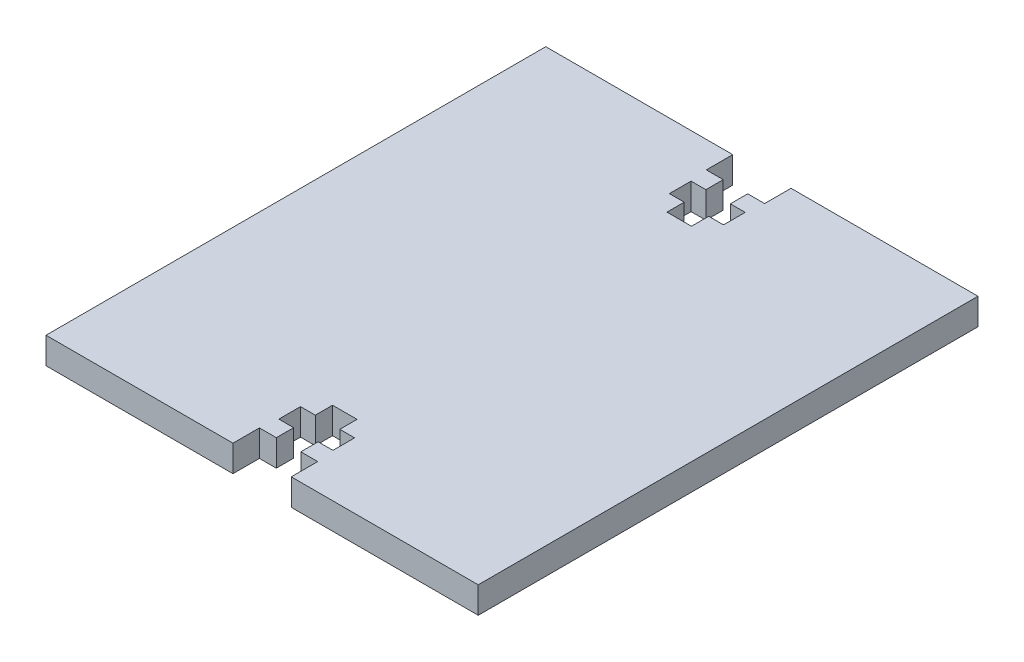
ISO-10303-21;
HEADER;
FILE_DESCRIPTION(('STEP AP214'),'2;1');
FILE_NAME('part.step','',(''),(''),'','','');
FILE_SCHEMA(('AUTOMOTIVE_DESIGN { 1 0 10303 214 1 1 1 1 }'));
ENDSEC;
DATA;
#1=APPLICATION_CONTEXT('core data for automotive mechanical design processes');
#2=APPLICATION_PROTOCOL_DEFINITION('international standard','automotive_design',2000,#1);
#3=PRODUCT_CONTEXT('',#1,'mechanical');
#4=PRODUCT('Part','Part','',(#3));
#5=PRODUCT_RELATED_PRODUCT_CATEGORY('part','',(#4));
#6=PRODUCT_DEFINITION_FORMATION('','',#4);
#7=PRODUCT_DEFINITION_CONTEXT('part definition',#1,'design');
#8=PRODUCT_DEFINITION('design','',#6,#7);
#9=PRODUCT_DEFINITION_SHAPE('','',#8);
#10=(LENGTH_UNIT() NAMED_UNIT(*) SI_UNIT(.MILLI.,.METRE.));
#11=(NAMED_UNIT(*) PLANE_ANGLE_UNIT() SI_UNIT($,.RADIAN.));
#12=(NAMED_UNIT(*) SI_UNIT($,.STERADIAN.) SOLID_ANGLE_UNIT());
#13=UNCERTAINTY_MEASURE_WITH_UNIT(LENGTH_MEASURE(1.E-05),#10,'distance_accuracy_value','');
#14=(GEOMETRIC_REPRESENTATION_CONTEXT(3) GLOBAL_UNCERTAINTY_ASSIGNED_CONTEXT((#13)) GLOBAL_UNIT_ASSIGNED_CONTEXT((#10,
#11,#12)) REPRESENTATION_CONTEXT('',''));
#15=CARTESIAN_POINT('',(0.,0.,0.));
#16=DIRECTION('',(0.,0.,1.));
#17=DIRECTION('',(1.,0.,0.));
#18=AXIS2_PLACEMENT_3D('',#15,#16,#17);
#19=CARTESIAN_POINT('',(-25.945,3.175,-30.));
#20=DIRECTION('',(0.,0.,1.));
#21=DIRECTION('',(1.,0.,0.));
#22=AXIS2_PLACEMENT_3D('',#19,#20,#21);
#23=PLANE('',#22);
#24=DIRECTION('',(-1.,0.,0.));
#25=VECTOR('',#24,1.);
#26=CARTESIAN_POINT('',(-25.945,3.175,-30.));
#27=LINE('',#26,#25);
#28=CARTESIAN_POINT('',(-3.5,3.175,-30.));
#29=VERTEX_POINT('',#28);
#30=CARTESIAN_POINT('',(-25.945,3.175,-30.));
#31=VERTEX_POINT('',#30);
#32=EDGE_CURVE('E435',#29,#31,#27,.T.);
#33=ORIENTED_EDGE('',*,*,#32,.F.);
#34=DIRECTION('',(0.,1.,0.));
#35=VECTOR('',#34,1.);
#36=CARTESIAN_POINT('',(-3.5,-6.825,-30.));
#37=LINE('',#36,#35);
#38=CARTESIAN_POINT('',(-3.5,0.,-30.));
#39=VERTEX_POINT('',#38);
#40=EDGE_CURVE('E282',#39,#29,#37,.T.);
#41=ORIENTED_EDGE('',*,*,#40,.F.);
#42=DIRECTION('',(-1.,0.,0.));
#43=VECTOR('',#42,1.);
#44=CARTESIAN_POINT('',(-25.945,0.,-30.));
#45=LINE('',#44,#43);
#46=CARTESIAN_POINT('',(-25.945,0.,-30.));
#47=VERTEX_POINT('',#46);
#48=EDGE_CURVE('E449',#39,#47,#45,.T.);
#49=ORIENTED_EDGE('',*,*,#48,.T.);
#50=DIRECTION('',(0.,-1.,0.));
#51=VECTOR('',#50,1.);
#52=CARTESIAN_POINT('',(-25.945,3.175,-30.));
#53=LINE('',#52,#51);
#54=EDGE_CURVE('E463',#31,#47,#53,.T.);
#55=ORIENTED_EDGE('',*,*,#54,.F.);
#56=EDGE_LOOP('',(#33,#41,#49,#55));
#57=FACE_BOUND('',#56,.T.);
#58=ADVANCED_FACE('F36',(#57),#23,.F.);
#59=CARTESIAN_POINT('',(-25.945,3.175,30.));
#60=DIRECTION('',(0.,0.,-1.));
#61=DIRECTION('',(-1.,0.,0.));
#62=AXIS2_PLACEMENT_3D('',#59,#60,#61);
#63=PLANE('',#62);
#64=DIRECTION('',(1.,0.,0.));
#65=VECTOR('',#64,1.);
#66=CARTESIAN_POINT('',(-25.945,3.175,30.));
#67=LINE('',#66,#65);
#68=CARTESIAN_POINT('',(3.5,3.175,30.));
#69=VERTEX_POINT('',#68);
#70=CARTESIAN_POINT('',(25.945,3.175,30.));
#71=VERTEX_POINT('',#70);
#72=EDGE_CURVE('E442',#69,#71,#67,.T.);
#73=ORIENTED_EDGE('',*,*,#72,.F.);
#74=DIRECTION('',(0.,1.,0.));
#75=VECTOR('',#74,1.);
#76=CARTESIAN_POINT('',(3.5,-6.825,30.));
#77=LINE('',#76,#75);
#78=CARTESIAN_POINT('',(3.5,0.,30.));
#79=VERTEX_POINT('',#78);
#80=EDGE_CURVE('E403',#79,#69,#77,.T.);
#81=ORIENTED_EDGE('',*,*,#80,.F.);
#82=DIRECTION('',(1.,0.,0.));
#83=VECTOR('',#82,1.);
#84=CARTESIAN_POINT('',(-25.945,0.,30.));
#85=LINE('',#84,#83);
#86=CARTESIAN_POINT('',(25.945,0.,30.));
#87=VERTEX_POINT('',#86);
#88=EDGE_CURVE('E455',#79,#87,#85,.T.);
#89=ORIENTED_EDGE('',*,*,#88,.T.);
#90=DIRECTION('',(0.,-1.,0.));
#91=VECTOR('',#90,1.);
#92=CARTESIAN_POINT('',(25.945,3.175,30.));
#93=LINE('',#92,#91);
#94=EDGE_CURVE('E446',#71,#87,#93,.T.);
#95=ORIENTED_EDGE('',*,*,#94,.F.);
#96=EDGE_LOOP('',(#73,#81,#89,#95));
#97=FACE_BOUND('',#96,.T.);
#98=ADVANCED_FACE('F567',(#97),#63,.F.);
#99=CARTESIAN_POINT('',(25.945,3.175,-30.));
#100=DIRECTION('',(-1.,0.,0.));
#101=DIRECTION('',(0.,0.,1.));
#102=AXIS2_PLACEMENT_3D('',#99,#100,#101);
#103=PLANE('',#102);
#104=DIRECTION('',(0.,0.,-1.));
#105=VECTOR('',#104,1.);
#106=CARTESIAN_POINT('',(25.945,0.,-30.));
#107=LINE('',#106,#105);
#108=CARTESIAN_POINT('',(25.945,0.,-30.));
#109=VERTEX_POINT('',#108);
#110=EDGE_CURVE('E329',#87,#109,#107,.T.);
#111=ORIENTED_EDGE('',*,*,#110,.T.);
#112=DIRECTION('',(0.,-1.,0.));
#113=VECTOR('',#112,1.);
#114=CARTESIAN_POINT('',(25.945,3.175,-30.));
#115=LINE('',#114,#113);
#116=CARTESIAN_POINT('',(25.945,3.175,-30.));
#117=VERTEX_POINT('',#116);
#118=EDGE_CURVE('E466',#117,#109,#115,.T.);
#119=ORIENTED_EDGE('',*,*,#118,.F.);
#120=DIRECTION('',(0.,0.,-1.));
#121=VECTOR('',#120,1.);
#122=CARTESIAN_POINT('',(25.945,3.175,-30.));
#123=LINE('',#122,#121);
#124=EDGE_CURVE('E432',#71,#117,#123,.T.);
#125=ORIENTED_EDGE('',*,*,#124,.F.);
#126=ORIENTED_EDGE('',*,*,#94,.T.);
#127=EDGE_LOOP('',(#111,#119,#125,#126));
#128=FACE_BOUND('',#127,.T.);
#129=ADVANCED_FACE('F38',(#128),#103,.F.);
#130=CARTESIAN_POINT('',(3.5,0.,-30.));
#131=VERTEX_POINT('',#130);
#132=EDGE_CURVE('E450',#109,#131,#45,.T.);
#133=ORIENTED_EDGE('',*,*,#132,.T.);
#134=DIRECTION('',(0.,1.,0.));
#135=VECTOR('',#134,1.);
#136=CARTESIAN_POINT('',(3.5,-6.825,-30.));
#137=LINE('',#136,#135);
#138=CARTESIAN_POINT('',(3.5,3.175,-30.));
#139=VERTEX_POINT('',#138);
#140=EDGE_CURVE('E330',#131,#139,#137,.T.);
#141=ORIENTED_EDGE('',*,*,#140,.T.);
#142=EDGE_CURVE('E437',#117,#139,#27,.T.);
#143=ORIENTED_EDGE('',*,*,#142,.F.);
#144=ORIENTED_EDGE('',*,*,#118,.T.);
#145=EDGE_LOOP('',(#133,#141,#143,#144));
#146=FACE_BOUND('',#145,.T.);
#147=ADVANCED_FACE('F558',(#146),#23,.F.);
#148=CARTESIAN_POINT('',(-25.945,3.175,-30.));
#149=DIRECTION('',(1.,0.,0.));
#150=DIRECTION('',(0.,0.,-1.));
#151=AXIS2_PLACEMENT_3D('',#148,#149,#150);
#152=PLANE('',#151);
#153=DIRECTION('',(0.,0.,1.));
#154=VECTOR('',#153,1.);
#155=CARTESIAN_POINT('',(-25.945,0.,-30.));
#156=LINE('',#155,#154);
#157=CARTESIAN_POINT('',(-25.945,0.,30.));
#158=VERTEX_POINT('',#157);
#159=EDGE_CURVE('E453',#47,#158,#156,.T.);
#160=ORIENTED_EDGE('',*,*,#159,.T.);
#161=DIRECTION('',(0.,-1.,0.));
#162=VECTOR('',#161,1.);
#163=CARTESIAN_POINT('',(-25.945,3.175,30.));
#164=LINE('',#163,#162);
#165=CARTESIAN_POINT('',(-25.945,3.175,30.));
#166=VERTEX_POINT('',#165);
#167=EDGE_CURVE('E460',#166,#158,#164,.T.);
#168=ORIENTED_EDGE('',*,*,#167,.F.);
#169=DIRECTION('',(0.,0.,1.));
#170=VECTOR('',#169,1.);
#171=CARTESIAN_POINT('',(-25.945,3.175,-30.));
#172=LINE('',#171,#170);
#173=EDGE_CURVE('E440',#31,#166,#172,.T.);
#174=ORIENTED_EDGE('',*,*,#173,.F.);
#175=ORIENTED_EDGE('',*,*,#54,.T.);
#176=EDGE_LOOP('',(#160,#168,#174,#175));
#177=FACE_BOUND('',#176,.T.);
#178=ADVANCED_FACE('F632',(#177),#152,.F.);
#179=CARTESIAN_POINT('',(-3.5,0.,30.));
#180=VERTEX_POINT('',#179);
#181=EDGE_CURVE('E436',#158,#180,#85,.T.);
#182=ORIENTED_EDGE('',*,*,#181,.T.);
#183=DIRECTION('',(0.,1.,0.));
#184=VECTOR('',#183,1.);
#185=CARTESIAN_POINT('',(-3.5,-6.825,30.));
#186=LINE('',#185,#184);
#187=CARTESIAN_POINT('',(-3.5,3.175,30.));
#188=VERTEX_POINT('',#187);
#189=EDGE_CURVE('E405',#180,#188,#186,.T.);
#190=ORIENTED_EDGE('',*,*,#189,.T.);
#191=EDGE_CURVE('E443',#166,#188,#67,.T.);
#192=ORIENTED_EDGE('',*,*,#191,.F.);
#193=ORIENTED_EDGE('',*,*,#167,.T.);
#194=EDGE_LOOP('',(#182,#190,#192,#193));
#195=FACE_BOUND('',#194,.T.);
#196=ADVANCED_FACE('F627',(#195),#63,.F.);
#197=CARTESIAN_POINT('',(0.,3.175,0.));
#198=DIRECTION('',(0.,1.,0.));
#199=DIRECTION('',(0.,0.,1.));
#200=AXIS2_PLACEMENT_3D('',#197,#198,#199);
#201=PLANE('',#200);
#202=DIRECTION('',(0.,0.,1.));
#203=VECTOR('',#202,1.);
#204=CARTESIAN_POINT('',(-3.5,3.175,-30.));
#205=LINE('',#204,#203);
#206=CARTESIAN_POINT('',(-3.5,3.175,-26.825));
#207=VERTEX_POINT('',#206);
#208=EDGE_CURVE('E279',#29,#207,#205,.T.);
#209=ORIENTED_EDGE('',*,*,#208,.F.);
#210=ORIENTED_EDGE('',*,*,#32,.T.);
#211=ORIENTED_EDGE('',*,*,#173,.T.);
#212=ORIENTED_EDGE('',*,*,#191,.T.);
#213=DIRECTION('',(0.,0.,1.));
#214=VECTOR('',#213,1.);
#215=CARTESIAN_POINT('',(-3.5,3.175,30.));
#216=LINE('',#215,#214);
#217=CARTESIAN_POINT('',(-3.5,3.175,26.825));
#218=VERTEX_POINT('',#217);
#219=EDGE_CURVE('E396',#218,#188,#216,.T.);
#220=ORIENTED_EDGE('',*,*,#219,.F.);
#221=DIRECTION('',(-1.,0.,0.));
#222=VECTOR('',#221,1.);
#223=CARTESIAN_POINT('',(-3.5,3.175,26.825));
#224=LINE('',#223,#222);
#225=CARTESIAN_POINT('',(-1.47,3.175,26.825));
#226=VERTEX_POINT('',#225);
#227=EDGE_CURVE('E393',#226,#218,#224,.T.);
#228=ORIENTED_EDGE('',*,*,#227,.F.);
#229=DIRECTION('',(0.,0.,1.));
#230=VECTOR('',#229,1.);
#231=CARTESIAN_POINT('',(-1.47,3.175,26.825));
#232=LINE('',#231,#230);
#233=CARTESIAN_POINT('',(-1.47,3.175,24.745));
#234=VERTEX_POINT('',#233);
#235=EDGE_CURVE('E390',#234,#226,#232,.T.);
#236=ORIENTED_EDGE('',*,*,#235,.F.);
#237=DIRECTION('',(1.,0.,0.));
#238=VECTOR('',#237,1.);
#239=CARTESIAN_POINT('',(-3.25,3.175,24.745));
#240=LINE('',#239,#238);
#241=CARTESIAN_POINT('',(-3.25,3.175,24.745));
#242=VERTEX_POINT('',#241);
#243=EDGE_CURVE('E387',#242,#234,#240,.T.);
#244=ORIENTED_EDGE('',*,*,#243,.F.);
#245=DIRECTION('',(0.,0.,1.));
#246=VECTOR('',#245,1.);
#247=CARTESIAN_POINT('',(-3.25,3.175,24.745));
#248=LINE('',#247,#246);
#249=CARTESIAN_POINT('',(-3.25,3.175,22.145));
#250=VERTEX_POINT('',#249);
#251=EDGE_CURVE('E384',#250,#242,#248,.T.);
#252=ORIENTED_EDGE('',*,*,#251,.F.);
#253=DIRECTION('',(-1.,0.,0.));
#254=VECTOR('',#253,1.);
#255=CARTESIAN_POINT('',(-3.25,3.175,22.145));
#256=LINE('',#255,#254);
#257=CARTESIAN_POINT('',(-1.47,3.175,22.145));
#258=VERTEX_POINT('',#257);
#259=EDGE_CURVE('E381',#258,#250,#256,.T.);
#260=ORIENTED_EDGE('',*,*,#259,.F.);
#261=DIRECTION('',(0.,0.,1.));
#262=VECTOR('',#261,1.);
#263=CARTESIAN_POINT('',(-1.47,3.175,22.145));
#264=LINE('',#263,#262);
#265=CARTESIAN_POINT('',(-1.47,3.175,20.075));
#266=VERTEX_POINT('',#265);
#267=EDGE_CURVE('E378',#266,#258,#264,.T.);
#268=ORIENTED_EDGE('',*,*,#267,.F.);
#269=DIRECTION('',(-1.,0.,0.));
#270=VECTOR('',#269,1.);
#271=CARTESIAN_POINT('',(-1.47,3.175,20.075));
#272=LINE('',#271,#270);
#273=CARTESIAN_POINT('',(1.47,3.175,20.075));
#274=VERTEX_POINT('',#273);
#275=EDGE_CURVE('E375',#274,#266,#272,.T.);
#276=ORIENTED_EDGE('',*,*,#275,.F.);
#277=DIRECTION('',(0.,0.,-1.));
#278=VECTOR('',#277,1.);
#279=CARTESIAN_POINT('',(1.47,3.175,22.145));
#280=LINE('',#279,#278);
#281=CARTESIAN_POINT('',(1.47,3.175,22.145));
#282=VERTEX_POINT('',#281);
#283=EDGE_CURVE('E372',#282,#274,#280,.T.);
#284=ORIENTED_EDGE('',*,*,#283,.F.);
#285=DIRECTION('',(-1.,0.,0.));
#286=VECTOR('',#285,1.);
#287=CARTESIAN_POINT('',(1.47,3.175,22.145));
#288=LINE('',#287,#286);
#289=CARTESIAN_POINT('',(3.25,3.175,22.145));
#290=VERTEX_POINT('',#289);
#291=EDGE_CURVE('E369',#290,#282,#288,.T.);
#292=ORIENTED_EDGE('',*,*,#291,.F.);
#293=DIRECTION('',(0.,0.,-1.));
#294=VECTOR('',#293,1.);
#295=CARTESIAN_POINT('',(3.25,3.175,24.745));
#296=LINE('',#295,#294);
#297=CARTESIAN_POINT('',(3.25,3.175,24.745));
#298=VERTEX_POINT('',#297);
#299=EDGE_CURVE('E366',#298,#290,#296,.T.);
#300=ORIENTED_EDGE('',*,*,#299,.F.);
#301=DIRECTION('',(1.,0.,0.));
#302=VECTOR('',#301,1.);
#303=CARTESIAN_POINT('',(1.47,3.175,24.745));
#304=LINE('',#303,#302);
#305=CARTESIAN_POINT('',(1.47,3.175,24.745));
#306=VERTEX_POINT('',#305);
#307=EDGE_CURVE('E363',#306,#298,#304,.T.);
#308=ORIENTED_EDGE('',*,*,#307,.F.);
#309=DIRECTION('',(0.,0.,-1.));
#310=VECTOR('',#309,1.);
#311=CARTESIAN_POINT('',(1.47,3.175,26.825));
#312=LINE('',#311,#310);
#313=CARTESIAN_POINT('',(1.47,3.175,26.825));
#314=VERTEX_POINT('',#313);
#315=EDGE_CURVE('E361',#314,#306,#312,.T.);
#316=ORIENTED_EDGE('',*,*,#315,.F.);
#317=DIRECTION('',(-1.,0.,0.));
#318=VECTOR('',#317,1.);
#319=CARTESIAN_POINT('',(1.47,3.175,26.825));
#320=LINE('',#319,#318);
#321=CARTESIAN_POINT('',(3.5,3.175,26.825));
#322=VERTEX_POINT('',#321);
#323=EDGE_CURVE('E358',#322,#314,#320,.T.);
#324=ORIENTED_EDGE('',*,*,#323,.F.);
#325=DIRECTION('',(0.,0.,-1.));
#326=VECTOR('',#325,1.);
#327=CARTESIAN_POINT('',(3.5,3.175,30.));
#328=LINE('',#327,#326);
#329=EDGE_CURVE('E398',#69,#322,#328,.T.);
#330=ORIENTED_EDGE('',*,*,#329,.F.);
#331=ORIENTED_EDGE('',*,*,#72,.T.);
#332=ORIENTED_EDGE('',*,*,#124,.T.);
#333=ORIENTED_EDGE('',*,*,#142,.T.);
#334=DIRECTION('',(0.,0.,-1.));
#335=VECTOR('',#334,1.);
#336=CARTESIAN_POINT('',(3.5,3.175,-30.));
#337=LINE('',#336,#335);
#338=CARTESIAN_POINT('',(3.5,3.175,-26.825));
#339=VERTEX_POINT('',#338);
#340=EDGE_CURVE('E276',#339,#139,#337,.T.);
#341=ORIENTED_EDGE('',*,*,#340,.F.);
#342=DIRECTION('',(1.,0.,0.));
#343=VECTOR('',#342,1.);
#344=CARTESIAN_POINT('',(1.47,3.175,-26.825));
#345=LINE('',#344,#343);
#346=CARTESIAN_POINT('',(1.47,3.175,-26.825));
#347=VERTEX_POINT('',#346);
#348=EDGE_CURVE('E324',#347,#339,#345,.T.);
#349=ORIENTED_EDGE('',*,*,#348,.F.);
#350=DIRECTION('',(0.,0.,-1.));
#351=VECTOR('',#350,1.);
#352=CARTESIAN_POINT('',(1.47,3.175,-26.825));
#353=LINE('',#352,#351);
#354=CARTESIAN_POINT('',(1.47,3.175,-24.745));
#355=VERTEX_POINT('',#354);
#356=EDGE_CURVE('E321',#355,#347,#353,.T.);
#357=ORIENTED_EDGE('',*,*,#356,.F.);
#358=DIRECTION('',(-1.,0.,0.));
#359=VECTOR('',#358,1.);
#360=CARTESIAN_POINT('',(1.47,3.175,-24.745));
#361=LINE('',#360,#359);
#362=CARTESIAN_POINT('',(3.25,3.175,-24.745));
#363=VERTEX_POINT('',#362);
#364=EDGE_CURVE('E318',#363,#355,#361,.T.);
#365=ORIENTED_EDGE('',*,*,#364,.F.);
#366=DIRECTION('',(0.,0.,-1.));
#367=VECTOR('',#366,1.);
#368=CARTESIAN_POINT('',(3.25,3.175,-24.745));
#369=LINE('',#368,#367);
#370=CARTESIAN_POINT('',(3.25,3.175,-22.145));
#371=VERTEX_POINT('',#370);
#372=EDGE_CURVE('E315',#371,#363,#369,.T.);
#373=ORIENTED_EDGE('',*,*,#372,.F.);
#374=DIRECTION('',(1.,0.,0.));
#375=VECTOR('',#374,1.);
#376=CARTESIAN_POINT('',(1.47,3.175,-22.145));
#377=LINE('',#376,#375);
#378=CARTESIAN_POINT('',(1.47,3.175,-22.145));
#379=VERTEX_POINT('',#378);
#380=EDGE_CURVE('E312',#379,#371,#377,.T.);
#381=ORIENTED_EDGE('',*,*,#380,.F.);
#382=DIRECTION('',(0.,0.,-1.));
#383=VECTOR('',#382,1.);
#384=CARTESIAN_POINT('',(1.47,3.175,-22.145));
#385=LINE('',#384,#383);
#386=CARTESIAN_POINT('',(1.47,3.175,-20.075));
#387=VERTEX_POINT('',#386);
#388=EDGE_CURVE('E309',#387,#379,#385,.T.);
#389=ORIENTED_EDGE('',*,*,#388,.F.);
#390=DIRECTION('',(1.,0.,0.));
#391=VECTOR('',#390,1.);
#392=CARTESIAN_POINT('',(-1.47,3.175,-20.075));
#393=LINE('',#392,#391);
#394=CARTESIAN_POINT('',(-1.47,3.175,-20.075));
#395=VERTEX_POINT('',#394);
#396=EDGE_CURVE('E306',#395,#387,#393,.T.);
#397=ORIENTED_EDGE('',*,*,#396,.F.);
#398=DIRECTION('',(0.,0.,1.));
#399=VECTOR('',#398,1.);
#400=CARTESIAN_POINT('',(-1.47,3.175,-22.145));
#401=LINE('',#400,#399);
#402=CARTESIAN_POINT('',(-1.47,3.175,-22.145));
#403=VERTEX_POINT('',#402);
#404=EDGE_CURVE('E303',#403,#395,#401,.T.);
#405=ORIENTED_EDGE('',*,*,#404,.F.);
#406=DIRECTION('',(1.,0.,0.));
#407=VECTOR('',#406,1.);
#408=CARTESIAN_POINT('',(-3.25,3.175,-22.145));
#409=LINE('',#408,#407);
#410=CARTESIAN_POINT('',(-3.25,3.175,-22.145));
#411=VERTEX_POINT('',#410);
#412=EDGE_CURVE('E300',#411,#403,#409,.T.);
#413=ORIENTED_EDGE('',*,*,#412,.F.);
#414=DIRECTION('',(0.,0.,1.));
#415=VECTOR('',#414,1.);
#416=CARTESIAN_POINT('',(-3.25,3.175,-24.745));
#417=LINE('',#416,#415);
#418=CARTESIAN_POINT('',(-3.25,3.175,-24.745));
#419=VERTEX_POINT('',#418);
#420=EDGE_CURVE('E297',#419,#411,#417,.T.);
#421=ORIENTED_EDGE('',*,*,#420,.F.);
#422=DIRECTION('',(-1.,0.,0.));
#423=VECTOR('',#422,1.);
#424=CARTESIAN_POINT('',(-3.25,3.175,-24.745));
#425=LINE('',#424,#423);
#426=CARTESIAN_POINT('',(-1.47,3.175,-24.745));
#427=VERTEX_POINT('',#426);
#428=EDGE_CURVE('E292',#427,#419,#425,.T.);
#429=ORIENTED_EDGE('',*,*,#428,.F.);
#430=DIRECTION('',(0.,0.,1.));
#431=VECTOR('',#430,1.);
#432=CARTESIAN_POINT('',(-1.47,3.175,-26.825));
#433=LINE('',#432,#431);
#434=CARTESIAN_POINT('',(-1.47,3.175,-26.825));
#435=VERTEX_POINT('',#434);
#436=EDGE_CURVE('E290',#435,#427,#433,.T.);
#437=ORIENTED_EDGE('',*,*,#436,.F.);
#438=DIRECTION('',(1.,0.,0.));
#439=VECTOR('',#438,1.);
#440=CARTESIAN_POINT('',(-3.5,3.175,-26.825));
#441=LINE('',#440,#439);
#442=EDGE_CURVE('E271',#207,#435,#441,.T.);
#443=ORIENTED_EDGE('',*,*,#442,.F.);
#444=EDGE_LOOP('',(#209,#210,#211,#212,#220,#228,#236,#244,#252,#260,#268,#276,#284,#292,#300,
#308,#316,#324,#330,#331,#332,#333,#341,#349,#357,#365,#373,#381,#389,#397,#405,#413,#421,#429,
#437,#443));
#445=FACE_BOUND('',#444,.T.);
#446=ADVANCED_FACE('F287',(#445),#201,.T.);
#447=CARTESIAN_POINT('',(0.,0.,0.));
#448=DIRECTION('',(0.,1.,0.));
#449=DIRECTION('',(0.,0.,1.));
#450=AXIS2_PLACEMENT_3D('',#447,#448,#449);
#451=PLANE('',#450);
#452=ORIENTED_EDGE('',*,*,#48,.F.);
#453=DIRECTION('',(0.,0.,1.));
#454=VECTOR('',#453,1.);
#455=CARTESIAN_POINT('',(-3.5,0.,0.));
#456=LINE('',#455,#454);
#457=CARTESIAN_POINT('',(-3.5,0.,-26.825));
#458=VERTEX_POINT('',#457);
#459=EDGE_CURVE('E11',#39,#458,#456,.T.);
#460=ORIENTED_EDGE('',*,*,#459,.T.);
#461=DIRECTION('',(1.,0.,0.));
#462=VECTOR('',#461,1.);
#463=CARTESIAN_POINT('',(0.,0.,-26.825));
#464=LINE('',#463,#462);
#465=CARTESIAN_POINT('',(-1.47,0.,-26.825));
#466=VERTEX_POINT('',#465);
#467=EDGE_CURVE('E274',#458,#466,#464,.T.);
#468=ORIENTED_EDGE('',*,*,#467,.T.);
#469=DIRECTION('',(0.,0.,1.));
#470=VECTOR('',#469,1.);
#471=CARTESIAN_POINT('',(-1.47,0.,0.));
#472=LINE('',#471,#470);
#473=CARTESIAN_POINT('',(-1.47,0.,-24.745));
#474=VERTEX_POINT('',#473);
#475=EDGE_CURVE('E515',#466,#474,#472,.T.);
#476=ORIENTED_EDGE('',*,*,#475,.T.);
#477=DIRECTION('',(-1.,0.,0.));
#478=VECTOR('',#477,1.);
#479=CARTESIAN_POINT('',(0.,0.,-24.745));
#480=LINE('',#479,#478);
#481=CARTESIAN_POINT('',(-3.25,0.,-24.745));
#482=VERTEX_POINT('',#481);
#483=EDGE_CURVE('E518',#474,#482,#480,.T.);
#484=ORIENTED_EDGE('',*,*,#483,.T.);
#485=DIRECTION('',(0.,0.,1.));
#486=VECTOR('',#485,1.);
#487=CARTESIAN_POINT('',(-3.25,0.,0.));
#488=LINE('',#487,#486);
#489=CARTESIAN_POINT('',(-3.25,0.,-22.145));
#490=VERTEX_POINT('',#489);
#491=EDGE_CURVE('E521',#482,#490,#488,.T.);
#492=ORIENTED_EDGE('',*,*,#491,.T.);
#493=DIRECTION('',(1.,0.,0.));
#494=VECTOR('',#493,1.);
#495=CARTESIAN_POINT('',(0.,0.,-22.145));
#496=LINE('',#495,#494);
#497=CARTESIAN_POINT('',(-1.47,0.,-22.145));
#498=VERTEX_POINT('',#497);
#499=EDGE_CURVE('E524',#490,#498,#496,.T.);
#500=ORIENTED_EDGE('',*,*,#499,.T.);
#501=DIRECTION('',(0.,0.,1.));
#502=VECTOR('',#501,1.);
#503=CARTESIAN_POINT('',(-1.47,0.,0.));
#504=LINE('',#503,#502);
#505=CARTESIAN_POINT('',(-1.47,0.,-20.075));
#506=VERTEX_POINT('',#505);
#507=EDGE_CURVE('E527',#498,#506,#504,.T.);
#508=ORIENTED_EDGE('',*,*,#507,.T.);
#509=DIRECTION('',(1.,0.,0.));
#510=VECTOR('',#509,1.);
#511=CARTESIAN_POINT('',(0.,0.,-20.075));
#512=LINE('',#511,#510);
#513=CARTESIAN_POINT('',(1.47,0.,-20.075));
#514=VERTEX_POINT('',#513);
#515=EDGE_CURVE('E530',#506,#514,#512,.T.);
#516=ORIENTED_EDGE('',*,*,#515,.T.);
#517=DIRECTION('',(0.,0.,-1.));
#518=VECTOR('',#517,1.);
#519=CARTESIAN_POINT('',(1.47,0.,0.));
#520=LINE('',#519,#518);
#521=CARTESIAN_POINT('',(1.47,0.,-22.145));
#522=VERTEX_POINT('',#521);
#523=EDGE_CURVE('E533',#514,#522,#520,.T.);
#524=ORIENTED_EDGE('',*,*,#523,.T.);
#525=DIRECTION('',(1.,0.,0.));
#526=VECTOR('',#525,1.);
#527=CARTESIAN_POINT('',(0.,0.,-22.145));
#528=LINE('',#527,#526);
#529=CARTESIAN_POINT('',(3.25,0.,-22.145));
#530=VERTEX_POINT('',#529);
#531=EDGE_CURVE('E536',#522,#530,#528,.T.);
#532=ORIENTED_EDGE('',*,*,#531,.T.);
#533=DIRECTION('',(0.,0.,-1.));
#534=VECTOR('',#533,1.);
#535=CARTESIAN_POINT('',(3.24999999999999,0.,0.));
#536=LINE('',#535,#534);
#537=CARTESIAN_POINT('',(3.25,0.,-24.745));
#538=VERTEX_POINT('',#537);
#539=EDGE_CURVE('E539',#530,#538,#536,.T.);
#540=ORIENTED_EDGE('',*,*,#539,.T.);
#541=DIRECTION('',(-1.,0.,0.));
#542=VECTOR('',#541,1.);
#543=CARTESIAN_POINT('',(0.,0.,-24.745));
#544=LINE('',#543,#542);
#545=CARTESIAN_POINT('',(1.47,0.,-24.745));
#546=VERTEX_POINT('',#545);
#547=EDGE_CURVE('E542',#538,#546,#544,.T.);
#548=ORIENTED_EDGE('',*,*,#547,.T.);
#549=DIRECTION('',(0.,0.,-1.));
#550=VECTOR('',#549,1.);
#551=CARTESIAN_POINT('',(1.47,0.,0.));
#552=LINE('',#551,#550);
#553=CARTESIAN_POINT('',(1.47,0.,-26.825));
#554=VERTEX_POINT('',#553);
#555=EDGE_CURVE('E545',#546,#554,#552,.T.);
#556=ORIENTED_EDGE('',*,*,#555,.T.);
#557=DIRECTION('',(1.,0.,0.));
#558=VECTOR('',#557,1.);
#559=CARTESIAN_POINT('',(0.,0.,-26.825));
#560=LINE('',#559,#558);
#561=CARTESIAN_POINT('',(3.5,0.,-26.825));
#562=VERTEX_POINT('',#561);
#563=EDGE_CURVE('E548',#554,#562,#560,.T.);
#564=ORIENTED_EDGE('',*,*,#563,.T.);
#565=DIRECTION('',(0.,0.,-1.));
#566=VECTOR('',#565,1.);
#567=CARTESIAN_POINT('',(3.50000000000001,0.,0.));
#568=LINE('',#567,#566);
#569=EDGE_CURVE('E44',#562,#131,#568,.T.);
#570=ORIENTED_EDGE('',*,*,#569,.T.);
#571=ORIENTED_EDGE('',*,*,#132,.F.);
#572=ORIENTED_EDGE('',*,*,#110,.F.);
#573=ORIENTED_EDGE('',*,*,#88,.F.);
#574=DIRECTION('',(0.,0.,-1.));
#575=VECTOR('',#574,1.);
#576=CARTESIAN_POINT('',(3.50000000000001,0.,0.));
#577=LINE('',#576,#575);
#578=CARTESIAN_POINT('',(3.5,0.,26.825));
#579=VERTEX_POINT('',#578);
#580=EDGE_CURVE('E511',#79,#579,#577,.T.);
#581=ORIENTED_EDGE('',*,*,#580,.T.);
#582=DIRECTION('',(-1.,0.,0.));
#583=VECTOR('',#582,1.);
#584=CARTESIAN_POINT('',(0.,0.,26.825));
#585=LINE('',#584,#583);
#586=CARTESIAN_POINT('',(1.47,0.,26.825));
#587=VERTEX_POINT('',#586);
#588=EDGE_CURVE('E508',#579,#587,#585,.T.);
#589=ORIENTED_EDGE('',*,*,#588,.T.);
#590=DIRECTION('',(0.,0.,-1.));
#591=VECTOR('',#590,1.);
#592=CARTESIAN_POINT('',(1.47,0.,0.));
#593=LINE('',#592,#591);
#594=CARTESIAN_POINT('',(1.47,0.,24.745));
#595=VERTEX_POINT('',#594);
#596=EDGE_CURVE('E469',#587,#595,#593,.T.);
#597=ORIENTED_EDGE('',*,*,#596,.T.);
#598=DIRECTION('',(1.,0.,0.));
#599=VECTOR('',#598,1.);
#600=CARTESIAN_POINT('',(0.,0.,24.745));
#601=LINE('',#600,#599);
#602=CARTESIAN_POINT('',(3.25,0.,24.745));
#603=VERTEX_POINT('',#602);
#604=EDGE_CURVE('E472',#595,#603,#601,.T.);
#605=ORIENTED_EDGE('',*,*,#604,.T.);
#606=DIRECTION('',(0.,0.,-1.));
#607=VECTOR('',#606,1.);
#608=CARTESIAN_POINT('',(3.24999999999999,0.,0.));
#609=LINE('',#608,#607);
#610=CARTESIAN_POINT('',(3.25,0.,22.145));
#611=VERTEX_POINT('',#610);
#612=EDGE_CURVE('E475',#603,#611,#609,.T.);
#613=ORIENTED_EDGE('',*,*,#612,.T.);
#614=DIRECTION('',(-1.,0.,0.));
#615=VECTOR('',#614,1.);
#616=CARTESIAN_POINT('',(0.,0.,22.145));
#617=LINE('',#616,#615);
#618=CARTESIAN_POINT('',(1.47,0.,22.145));
#619=VERTEX_POINT('',#618);
#620=EDGE_CURVE('E478',#611,#619,#617,.T.);
#621=ORIENTED_EDGE('',*,*,#620,.T.);
#622=DIRECTION('',(0.,0.,-1.));
#623=VECTOR('',#622,1.);
#624=CARTESIAN_POINT('',(1.47,0.,0.));
#625=LINE('',#624,#623);
#626=CARTESIAN_POINT('',(1.47,0.,20.075));
#627=VERTEX_POINT('',#626);
#628=EDGE_CURVE('E481',#619,#627,#625,.T.);
#629=ORIENTED_EDGE('',*,*,#628,.T.);
#630=DIRECTION('',(-1.,0.,0.));
#631=VECTOR('',#630,1.);
#632=CARTESIAN_POINT('',(0.,0.,20.075));
#633=LINE('',#632,#631);
#634=CARTESIAN_POINT('',(-1.47,0.,20.075));
#635=VERTEX_POINT('',#634);
#636=EDGE_CURVE('E484',#627,#635,#633,.T.);
#637=ORIENTED_EDGE('',*,*,#636,.T.);
#638=DIRECTION('',(0.,0.,1.));
#639=VECTOR('',#638,1.);
#640=CARTESIAN_POINT('',(-1.47,0.,0.));
#641=LINE('',#640,#639);
#642=CARTESIAN_POINT('',(-1.47,0.,22.145));
#643=VERTEX_POINT('',#642);
#644=EDGE_CURVE('E487',#635,#643,#641,.T.);
#645=ORIENTED_EDGE('',*,*,#644,.T.);
#646=DIRECTION('',(-1.,0.,0.));
#647=VECTOR('',#646,1.);
#648=CARTESIAN_POINT('',(0.,0.,22.145));
#649=LINE('',#648,#647);
#650=CARTESIAN_POINT('',(-3.25,0.,22.145));
#651=VERTEX_POINT('',#650);
#652=EDGE_CURVE('E490',#643,#651,#649,.T.);
#653=ORIENTED_EDGE('',*,*,#652,.T.);
#654=DIRECTION('',(0.,0.,1.));
#655=VECTOR('',#654,1.);
#656=CARTESIAN_POINT('',(-3.25,0.,0.));
#657=LINE('',#656,#655);
#658=CARTESIAN_POINT('',(-3.25,0.,24.745));
#659=VERTEX_POINT('',#658);
#660=EDGE_CURVE('E493',#651,#659,#657,.T.);
#661=ORIENTED_EDGE('',*,*,#660,.T.);
#662=DIRECTION('',(1.,0.,0.));
#663=VECTOR('',#662,1.);
#664=CARTESIAN_POINT('',(0.,0.,24.745));
#665=LINE('',#664,#663);
#666=CARTESIAN_POINT('',(-1.47,0.,24.745));
#667=VERTEX_POINT('',#666);
#668=EDGE_CURVE('E496',#659,#667,#665,.T.);
#669=ORIENTED_EDGE('',*,*,#668,.T.);
#670=DIRECTION('',(0.,0.,1.));
#671=VECTOR('',#670,1.);
#672=CARTESIAN_POINT('',(-1.47,0.,0.));
#673=LINE('',#672,#671);
#674=CARTESIAN_POINT('',(-1.47,0.,26.825));
#675=VERTEX_POINT('',#674);
#676=EDGE_CURVE('E499',#667,#675,#673,.T.);
#677=ORIENTED_EDGE('',*,*,#676,.T.);
#678=DIRECTION('',(-1.,0.,0.));
#679=VECTOR('',#678,1.);
#680=CARTESIAN_POINT('',(0.,0.,26.825));
#681=LINE('',#680,#679);
#682=CARTESIAN_POINT('',(-3.5,0.,26.825));
#683=VERTEX_POINT('',#682);
#684=EDGE_CURVE('E502',#675,#683,#681,.T.);
#685=ORIENTED_EDGE('',*,*,#684,.T.);
#686=DIRECTION('',(0.,0.,1.));
#687=VECTOR('',#686,1.);
#688=CARTESIAN_POINT('',(-3.5,0.,0.));
#689=LINE('',#688,#687);
#690=EDGE_CURVE('E505',#683,#180,#689,.T.);
#691=ORIENTED_EDGE('',*,*,#690,.T.);
#692=ORIENTED_EDGE('',*,*,#181,.F.);
#693=ORIENTED_EDGE('',*,*,#159,.F.);
#694=EDGE_LOOP('',(#452,#460,#468,#476,#484,#492,#500,#508,#516,#524,#532,#540,#548,#556,#564,
#570,#571,#572,#573,#581,#589,#597,#605,#613,#621,#629,#637,#645,#653,#661,#669,#677,#685,#691,
#692,#693));
#695=FACE_BOUND('',#694,.T.);
#696=ADVANCED_FACE('F553',(#695),#451,.F.);
#697=CARTESIAN_POINT('',(1.47,-6.825,26.825));
#698=DIRECTION('',(0.,0.,-1.));
#699=DIRECTION('',(-1.,0.,0.));
#700=AXIS2_PLACEMENT_3D('',#697,#698,#699);
#701=PLANE('',#700);
#702=DIRECTION('',(0.,1.,0.));
#703=VECTOR('',#702,1.);
#704=CARTESIAN_POINT('',(3.5,-6.825,26.825));
#705=LINE('',#704,#703);
#706=EDGE_CURVE('E285',#579,#322,#705,.T.);
#707=ORIENTED_EDGE('',*,*,#706,.T.);
#708=ORIENTED_EDGE('',*,*,#323,.T.);
#709=DIRECTION('',(0.,1.,0.));
#710=VECTOR('',#709,1.);
#711=CARTESIAN_POINT('',(1.47,-6.825,26.825));
#712=LINE('',#711,#710);
#713=EDGE_CURVE('E401',#587,#314,#712,.T.);
#714=ORIENTED_EDGE('',*,*,#713,.F.);
#715=ORIENTED_EDGE('',*,*,#588,.F.);
#716=EDGE_LOOP('',(#707,#708,#714,#715));
#717=FACE_BOUND('',#716,.T.);
#718=ADVANCED_FACE('F577',(#717),#701,.F.);
#719=CARTESIAN_POINT('',(3.5,-6.825,30.));
#720=DIRECTION('',(1.,0.,0.));
#721=DIRECTION('',(0.,0.,-1.));
#722=AXIS2_PLACEMENT_3D('',#719,#720,#721);
#723=PLANE('',#722);
#724=ORIENTED_EDGE('',*,*,#80,.T.);
#725=ORIENTED_EDGE('',*,*,#329,.T.);
#726=ORIENTED_EDGE('',*,*,#706,.F.);
#727=ORIENTED_EDGE('',*,*,#580,.F.);
#728=EDGE_LOOP('',(#724,#725,#726,#727));
#729=FACE_BOUND('',#728,.T.);
#730=ADVANCED_FACE('F570',(#729),#723,.F.);
#731=CARTESIAN_POINT('',(-3.5,-6.825,30.));
#732=DIRECTION('',(-1.,0.,0.));
#733=DIRECTION('',(0.,0.,1.));
#734=AXIS2_PLACEMENT_3D('',#731,#732,#733);
#735=PLANE('',#734);
#736=DIRECTION('',(0.,1.,0.));
#737=VECTOR('',#736,1.);
#738=CARTESIAN_POINT('',(-3.5,-6.825,26.825));
#739=LINE('',#738,#737);
#740=EDGE_CURVE('E408',#683,#218,#739,.T.);
#741=ORIENTED_EDGE('',*,*,#740,.T.);
#742=ORIENTED_EDGE('',*,*,#219,.T.);
#743=ORIENTED_EDGE('',*,*,#189,.F.);
#744=ORIENTED_EDGE('',*,*,#690,.F.);
#745=EDGE_LOOP('',(#741,#742,#743,#744));
#746=FACE_BOUND('',#745,.T.);
#747=ADVANCED_FACE('F635',(#746),#735,.F.);
#748=CARTESIAN_POINT('',(-3.5,-6.825,26.825));
#749=DIRECTION('',(0.,0.,-1.));
#750=DIRECTION('',(-1.,0.,0.));
#751=AXIS2_PLACEMENT_3D('',#748,#749,#750);
#752=PLANE('',#751);
#753=DIRECTION('',(0.,1.,0.));
#754=VECTOR('',#753,1.);
#755=CARTESIAN_POINT('',(-1.47,-6.825,26.825));
#756=LINE('',#755,#754);
#757=EDGE_CURVE('E410',#675,#226,#756,.T.);
#758=ORIENTED_EDGE('',*,*,#757,.T.);
#759=ORIENTED_EDGE('',*,*,#227,.T.);
#760=ORIENTED_EDGE('',*,*,#740,.F.);
#761=ORIENTED_EDGE('',*,*,#684,.F.);
#762=EDGE_LOOP('',(#758,#759,#760,#761));
#763=FACE_BOUND('',#762,.T.);
#764=ADVANCED_FACE('F620',(#763),#752,.F.);
#765=CARTESIAN_POINT('',(-1.47,-6.825,26.825));
#766=DIRECTION('',(-1.,0.,0.));
#767=DIRECTION('',(0.,0.,1.));
#768=AXIS2_PLACEMENT_3D('',#765,#766,#767);
#769=PLANE('',#768);
#770=DIRECTION('',(0.,1.,0.));
#771=VECTOR('',#770,1.);
#772=CARTESIAN_POINT('',(-1.47,-6.825,24.745));
#773=LINE('',#772,#771);
#774=EDGE_CURVE('E412',#667,#234,#773,.T.);
#775=ORIENTED_EDGE('',*,*,#774,.T.);
#776=ORIENTED_EDGE('',*,*,#235,.T.);
#777=ORIENTED_EDGE('',*,*,#757,.F.);
#778=ORIENTED_EDGE('',*,*,#676,.F.);
#779=EDGE_LOOP('',(#775,#776,#777,#778));
#780=FACE_BOUND('',#779,.T.);
#781=ADVANCED_FACE('F616',(#780),#769,.F.);
#782=CARTESIAN_POINT('',(-3.25,-6.825,24.745));
#783=DIRECTION('',(0.,0.,1.));
#784=DIRECTION('',(1.,0.,0.));
#785=AXIS2_PLACEMENT_3D('',#782,#783,#784);
#786=PLANE('',#785);
#787=DIRECTION('',(0.,1.,0.));
#788=VECTOR('',#787,1.);
#789=CARTESIAN_POINT('',(-3.25,-6.825,24.745));
#790=LINE('',#789,#788);
#791=EDGE_CURVE('E414',#659,#242,#790,.T.);
#792=ORIENTED_EDGE('',*,*,#791,.T.);
#793=ORIENTED_EDGE('',*,*,#243,.T.);
#794=ORIENTED_EDGE('',*,*,#774,.F.);
#795=ORIENTED_EDGE('',*,*,#668,.F.);
#796=EDGE_LOOP('',(#792,#793,#794,#795));
#797=FACE_BOUND('',#796,.T.);
#798=ADVANCED_FACE('F613',(#797),#786,.F.);
#799=CARTESIAN_POINT('',(-3.25,-6.825,24.745));
#800=DIRECTION('',(-1.,0.,0.));
#801=DIRECTION('',(0.,0.,1.));
#802=AXIS2_PLACEMENT_3D('',#799,#800,#801);
#803=PLANE('',#802);
#804=DIRECTION('',(0.,1.,0.));
#805=VECTOR('',#804,1.);
#806=CARTESIAN_POINT('',(-3.25,-6.825,22.145));
#807=LINE('',#806,#805);
#808=EDGE_CURVE('E416',#651,#250,#807,.T.);
#809=ORIENTED_EDGE('',*,*,#808,.T.);
#810=ORIENTED_EDGE('',*,*,#251,.T.);
#811=ORIENTED_EDGE('',*,*,#791,.F.);
#812=ORIENTED_EDGE('',*,*,#660,.F.);
#813=EDGE_LOOP('',(#809,#810,#811,#812));
#814=FACE_BOUND('',#813,.T.);
#815=ADVANCED_FACE('F608',(#814),#803,.F.);
#816=CARTESIAN_POINT('',(-3.25,-6.825,22.145));
#817=DIRECTION('',(0.,0.,-1.));
#818=DIRECTION('',(-1.,0.,0.));
#819=AXIS2_PLACEMENT_3D('',#816,#817,#818);
#820=PLANE('',#819);
#821=DIRECTION('',(0.,1.,0.));
#822=VECTOR('',#821,1.);
#823=CARTESIAN_POINT('',(-1.47,-6.825,22.145));
#824=LINE('',#823,#822);
#825=EDGE_CURVE('E418',#643,#258,#824,.T.);
#826=ORIENTED_EDGE('',*,*,#825,.T.);
#827=ORIENTED_EDGE('',*,*,#259,.T.);
#828=ORIENTED_EDGE('',*,*,#808,.F.);
#829=ORIENTED_EDGE('',*,*,#652,.F.);
#830=EDGE_LOOP('',(#826,#827,#828,#829));
#831=FACE_BOUND('',#830,.T.);
#832=ADVANCED_FACE('F604',(#831),#820,.F.);
#833=CARTESIAN_POINT('',(-1.47,-6.825,22.145));
#834=DIRECTION('',(-1.,0.,0.));
#835=DIRECTION('',(0.,0.,1.));
#836=AXIS2_PLACEMENT_3D('',#833,#834,#835);
#837=PLANE('',#836);
#838=DIRECTION('',(0.,1.,0.));
#839=VECTOR('',#838,1.);
#840=CARTESIAN_POINT('',(-1.47,-6.825,20.075));
#841=LINE('',#840,#839);
#842=EDGE_CURVE('E420',#635,#266,#841,.T.);
#843=ORIENTED_EDGE('',*,*,#842,.T.);
#844=ORIENTED_EDGE('',*,*,#267,.T.);
#845=ORIENTED_EDGE('',*,*,#825,.F.);
#846=ORIENTED_EDGE('',*,*,#644,.F.);
#847=EDGE_LOOP('',(#843,#844,#845,#846));
#848=FACE_BOUND('',#847,.T.);
#849=ADVANCED_FACE('F601',(#848),#837,.F.);
#850=CARTESIAN_POINT('',(-1.47,-6.825,20.075));
#851=DIRECTION('',(0.,0.,-1.));
#852=DIRECTION('',(-1.,0.,0.));
#853=AXIS2_PLACEMENT_3D('',#850,#851,#852);
#854=PLANE('',#853);
#855=DIRECTION('',(0.,1.,0.));
#856=VECTOR('',#855,1.);
#857=CARTESIAN_POINT('',(1.47,-6.825,20.075));
#858=LINE('',#857,#856);
#859=EDGE_CURVE('E422',#627,#274,#858,.T.);
#860=ORIENTED_EDGE('',*,*,#859,.T.);
#861=ORIENTED_EDGE('',*,*,#275,.T.);
#862=ORIENTED_EDGE('',*,*,#842,.F.);
#863=ORIENTED_EDGE('',*,*,#636,.F.);
#864=EDGE_LOOP('',(#860,#861,#862,#863));
#865=FACE_BOUND('',#864,.T.);
#866=ADVANCED_FACE('F596',(#865),#854,.F.);
#867=CARTESIAN_POINT('',(1.47,-6.825,22.145));
#868=DIRECTION('',(1.,0.,0.));
#869=DIRECTION('',(0.,0.,-1.));
#870=AXIS2_PLACEMENT_3D('',#867,#868,#869);
#871=PLANE('',#870);
#872=DIRECTION('',(0.,1.,0.));
#873=VECTOR('',#872,1.);
#874=CARTESIAN_POINT('',(1.47,-6.825,22.145));
#875=LINE('',#874,#873);
#876=EDGE_CURVE('E424',#619,#282,#875,.T.);
#877=ORIENTED_EDGE('',*,*,#876,.T.);
#878=ORIENTED_EDGE('',*,*,#283,.T.);
#879=ORIENTED_EDGE('',*,*,#859,.F.);
#880=ORIENTED_EDGE('',*,*,#628,.F.);
#881=EDGE_LOOP('',(#877,#878,#879,#880));
#882=FACE_BOUND('',#881,.T.);
#883=ADVANCED_FACE('F592',(#882),#871,.F.);
#884=CARTESIAN_POINT('',(1.47,-6.825,22.145));
#885=DIRECTION('',(0.,0.,-1.));
#886=DIRECTION('',(-1.,0.,0.));
#887=AXIS2_PLACEMENT_3D('',#884,#885,#886);
#888=PLANE('',#887);
#889=DIRECTION('',(0.,1.,0.));
#890=VECTOR('',#889,1.);
#891=CARTESIAN_POINT('',(3.25,-6.825,22.145));
#892=LINE('',#891,#890);
#893=EDGE_CURVE('E426',#611,#290,#892,.T.);
#894=ORIENTED_EDGE('',*,*,#893,.T.);
#895=ORIENTED_EDGE('',*,*,#291,.T.);
#896=ORIENTED_EDGE('',*,*,#876,.F.);
#897=ORIENTED_EDGE('',*,*,#620,.F.);
#898=EDGE_LOOP('',(#894,#895,#896,#897));
#899=FACE_BOUND('',#898,.T.);
#900=ADVANCED_FACE('F589',(#899),#888,.F.);
#901=CARTESIAN_POINT('',(3.25,-6.825,24.745));
#902=DIRECTION('',(1.,0.,0.));
#903=DIRECTION('',(0.,0.,-1.));
#904=AXIS2_PLACEMENT_3D('',#901,#902,#903);
#905=PLANE('',#904);
#906=DIRECTION('',(0.,1.,0.));
#907=VECTOR('',#906,1.);
#908=CARTESIAN_POINT('',(3.25,-6.825,24.745));
#909=LINE('',#908,#907);
#910=EDGE_CURVE('E428',#603,#298,#909,.T.);
#911=ORIENTED_EDGE('',*,*,#910,.T.);
#912=ORIENTED_EDGE('',*,*,#299,.T.);
#913=ORIENTED_EDGE('',*,*,#893,.F.);
#914=ORIENTED_EDGE('',*,*,#612,.F.);
#915=EDGE_LOOP('',(#911,#912,#913,#914));
#916=FACE_BOUND('',#915,.T.);
#917=ADVANCED_FACE('F585',(#916),#905,.F.);
#918=CARTESIAN_POINT('',(1.47,-6.825,24.745));
#919=DIRECTION('',(0.,0.,1.));
#920=DIRECTION('',(1.,0.,0.));
#921=AXIS2_PLACEMENT_3D('',#918,#919,#920);
#922=PLANE('',#921);
#923=DIRECTION('',(0.,1.,0.));
#924=VECTOR('',#923,1.);
#925=CARTESIAN_POINT('',(1.47,-6.825,24.745));
#926=LINE('',#925,#924);
#927=EDGE_CURVE('E59',#595,#306,#926,.T.);
#928=ORIENTED_EDGE('',*,*,#927,.T.);
#929=ORIENTED_EDGE('',*,*,#307,.T.);
#930=ORIENTED_EDGE('',*,*,#910,.F.);
#931=ORIENTED_EDGE('',*,*,#604,.F.);
#932=EDGE_LOOP('',(#928,#929,#930,#931));
#933=FACE_BOUND('',#932,.T.);
#934=ADVANCED_FACE('F583',(#933),#922,.F.);
#935=CARTESIAN_POINT('',(1.47,-6.825,26.825));
#936=DIRECTION('',(1.,0.,0.));
#937=DIRECTION('',(0.,0.,-1.));
#938=AXIS2_PLACEMENT_3D('',#935,#936,#937);
#939=PLANE('',#938);
#940=ORIENTED_EDGE('',*,*,#713,.T.);
#941=ORIENTED_EDGE('',*,*,#315,.T.);
#942=ORIENTED_EDGE('',*,*,#927,.F.);
#943=ORIENTED_EDGE('',*,*,#596,.F.);
#944=EDGE_LOOP('',(#940,#941,#942,#943));
#945=FACE_BOUND('',#944,.T.);
#946=ADVANCED_FACE('F578',(#945),#939,.F.);
#947=CARTESIAN_POINT('',(-3.5,-6.825,-30.));
#948=DIRECTION('',(-1.,0.,0.));
#949=DIRECTION('',(0.,0.,1.));
#950=AXIS2_PLACEMENT_3D('',#947,#948,#949);
#951=PLANE('',#950);
#952=ORIENTED_EDGE('',*,*,#40,.T.);
#953=ORIENTED_EDGE('',*,*,#208,.T.);
#954=DIRECTION('',(0.,1.,0.));
#955=VECTOR('',#954,1.);
#956=CARTESIAN_POINT('',(-3.5,-6.825,-26.825));
#957=LINE('',#956,#955);
#958=EDGE_CURVE('E267',#458,#207,#957,.T.);
#959=ORIENTED_EDGE('',*,*,#958,.F.);
#960=ORIENTED_EDGE('',*,*,#459,.F.);
#961=EDGE_LOOP('',(#952,#953,#959,#960));
#962=FACE_BOUND('',#961,.T.);
#963=ADVANCED_FACE('F280',(#962),#951,.F.);
#964=CARTESIAN_POINT('',(3.5,-6.825,-30.));
#965=DIRECTION('',(1.,0.,0.));
#966=DIRECTION('',(0.,0.,-1.));
#967=AXIS2_PLACEMENT_3D('',#964,#965,#966);
#968=PLANE('',#967);
#969=DIRECTION('',(0.,1.,0.));
#970=VECTOR('',#969,1.);
#971=CARTESIAN_POINT('',(3.5,-6.825,-26.825));
#972=LINE('',#971,#970);
#973=EDGE_CURVE('E333',#562,#339,#972,.T.);
#974=ORIENTED_EDGE('',*,*,#973,.T.);
#975=ORIENTED_EDGE('',*,*,#340,.T.);
#976=ORIENTED_EDGE('',*,*,#140,.F.);
#977=ORIENTED_EDGE('',*,*,#569,.F.);
#978=EDGE_LOOP('',(#974,#975,#976,#977));
#979=FACE_BOUND('',#978,.T.);
#980=ADVANCED_FACE('F813',(#979),#968,.F.);
#981=CARTESIAN_POINT('',(1.47,-6.825,-26.825));
#982=DIRECTION('',(0.,0.,1.));
#983=DIRECTION('',(1.,0.,0.));
#984=AXIS2_PLACEMENT_3D('',#981,#982,#983);
#985=PLANE('',#984);
#986=DIRECTION('',(0.,1.,0.));
#987=VECTOR('',#986,1.);
#988=CARTESIAN_POINT('',(1.47,-6.825,-26.825));
#989=LINE('',#988,#987);
#990=EDGE_CURVE('E335',#554,#347,#989,.T.);
#991=ORIENTED_EDGE('',*,*,#990,.T.);
#992=ORIENTED_EDGE('',*,*,#348,.T.);
#993=ORIENTED_EDGE('',*,*,#973,.F.);
#994=ORIENTED_EDGE('',*,*,#563,.F.);
#995=EDGE_LOOP('',(#991,#992,#993,#994));
#996=FACE_BOUND('',#995,.T.);
#997=ADVANCED_FACE('F822',(#996),#985,.F.);
#998=CARTESIAN_POINT('',(1.47,-6.825,-26.825));
#999=DIRECTION('',(1.,0.,0.));
#1000=DIRECTION('',(0.,0.,-1.));
#1001=AXIS2_PLACEMENT_3D('',#998,#999,#1000);
#1002=PLANE('',#1001);
#1003=DIRECTION('',(0.,1.,0.));
#1004=VECTOR('',#1003,1.);
#1005=CARTESIAN_POINT('',(1.47,-6.825,-24.745));
#1006=LINE('',#1005,#1004);
#1007=EDGE_CURVE('E337',#546,#355,#1006,.T.);
#1008=ORIENTED_EDGE('',*,*,#1007,.T.);
#1009=ORIENTED_EDGE('',*,*,#356,.T.);
#1010=ORIENTED_EDGE('',*,*,#990,.F.);
#1011=ORIENTED_EDGE('',*,*,#555,.F.);
#1012=EDGE_LOOP('',(#1008,#1009,#1010,#1011));
#1013=FACE_BOUND('',#1012,.T.);
#1014=ADVANCED_FACE('F831',(#1013),#1002,.F.);
#1015=CARTESIAN_POINT('',(1.47,-6.825,-24.745));
#1016=DIRECTION('',(0.,0.,-1.));
#1017=DIRECTION('',(-1.,0.,0.));
#1018=AXIS2_PLACEMENT_3D('',#1015,#1016,#1017);
#1019=PLANE('',#1018);
#1020=DIRECTION('',(0.,1.,0.));
#1021=VECTOR('',#1020,1.);
#1022=CARTESIAN_POINT('',(3.25,-6.825,-24.745));
#1023=LINE('',#1022,#1021);
#1024=EDGE_CURVE('E339',#538,#363,#1023,.T.);
#1025=ORIENTED_EDGE('',*,*,#1024,.T.);
#1026=ORIENTED_EDGE('',*,*,#364,.T.);
#1027=ORIENTED_EDGE('',*,*,#1007,.F.);
#1028=ORIENTED_EDGE('',*,*,#547,.F.);
#1029=EDGE_LOOP('',(#1025,#1026,#1027,#1028));
#1030=FACE_BOUND('',#1029,.T.);
#1031=ADVANCED_FACE('F841',(#1030),#1019,.F.);
#1032=CARTESIAN_POINT('',(3.25,-6.825,-24.745));
#1033=DIRECTION('',(1.,0.,0.));
#1034=DIRECTION('',(0.,0.,-1.));
#1035=AXIS2_PLACEMENT_3D('',#1032,#1033,#1034);
#1036=PLANE('',#1035);
#1037=DIRECTION('',(0.,1.,0.));
#1038=VECTOR('',#1037,1.);
#1039=CARTESIAN_POINT('',(3.25,-6.825,-22.145));
#1040=LINE('',#1039,#1038);
#1041=EDGE_CURVE('E341',#530,#371,#1040,.T.);
#1042=ORIENTED_EDGE('',*,*,#1041,.T.);
#1043=ORIENTED_EDGE('',*,*,#372,.T.);
#1044=ORIENTED_EDGE('',*,*,#1024,.F.);
#1045=ORIENTED_EDGE('',*,*,#539,.F.);
#1046=EDGE_LOOP('',(#1042,#1043,#1044,#1045));
#1047=FACE_BOUND('',#1046,.T.);
#1048=ADVANCED_FACE('F851',(#1047),#1036,.F.);
#1049=CARTESIAN_POINT('',(1.47,-6.825,-22.145));
#1050=DIRECTION('',(0.,0.,1.));
#1051=DIRECTION('',(1.,0.,0.));
#1052=AXIS2_PLACEMENT_3D('',#1049,#1050,#1051);
#1053=PLANE('',#1052);
#1054=DIRECTION('',(0.,1.,0.));
#1055=VECTOR('',#1054,1.);
#1056=CARTESIAN_POINT('',(1.47,-6.825,-22.145));
#1057=LINE('',#1056,#1055);
#1058=EDGE_CURVE('E343',#522,#379,#1057,.T.);
#1059=ORIENTED_EDGE('',*,*,#1058,.T.);
#1060=ORIENTED_EDGE('',*,*,#380,.T.);
#1061=ORIENTED_EDGE('',*,*,#1041,.F.);
#1062=ORIENTED_EDGE('',*,*,#531,.F.);
#1063=EDGE_LOOP('',(#1059,#1060,#1061,#1062));
#1064=FACE_BOUND('',#1063,.T.);
#1065=ADVANCED_FACE('F861',(#1064),#1053,.F.);
#1066=CARTESIAN_POINT('',(1.47,-6.825,-22.145));
#1067=DIRECTION('',(1.,0.,0.));
#1068=DIRECTION('',(0.,0.,-1.));
#1069=AXIS2_PLACEMENT_3D('',#1066,#1067,#1068);
#1070=PLANE('',#1069);
#1071=DIRECTION('',(0.,1.,0.));
#1072=VECTOR('',#1071,1.);
#1073=CARTESIAN_POINT('',(1.47,-6.825,-20.075));
#1074=LINE('',#1073,#1072);
#1075=EDGE_CURVE('E345',#514,#387,#1074,.T.);
#1076=ORIENTED_EDGE('',*,*,#1075,.T.);
#1077=ORIENTED_EDGE('',*,*,#388,.T.);
#1078=ORIENTED_EDGE('',*,*,#1058,.F.);
#1079=ORIENTED_EDGE('',*,*,#523,.F.);
#1080=EDGE_LOOP('',(#1076,#1077,#1078,#1079));
#1081=FACE_BOUND('',#1080,.T.);
#1082=ADVANCED_FACE('F871',(#1081),#1070,.F.);
#1083=CARTESIAN_POINT('',(-1.47,-6.825,-20.075));
#1084=DIRECTION('',(0.,0.,1.));
#1085=DIRECTION('',(1.,0.,0.));
#1086=AXIS2_PLACEMENT_3D('',#1083,#1084,#1085);
#1087=PLANE('',#1086);
#1088=DIRECTION('',(0.,1.,0.));
#1089=VECTOR('',#1088,1.);
#1090=CARTESIAN_POINT('',(-1.47,-6.825,-20.075));
#1091=LINE('',#1090,#1089);
#1092=EDGE_CURVE('E347',#506,#395,#1091,.T.);
#1093=ORIENTED_EDGE('',*,*,#1092,.T.);
#1094=ORIENTED_EDGE('',*,*,#396,.T.);
#1095=ORIENTED_EDGE('',*,*,#1075,.F.);
#1096=ORIENTED_EDGE('',*,*,#515,.F.);
#1097=EDGE_LOOP('',(#1093,#1094,#1095,#1096));
#1098=FACE_BOUND('',#1097,.T.);
#1099=ADVANCED_FACE('F881',(#1098),#1087,.F.);
#1100=CARTESIAN_POINT('',(-1.47,-6.825,-22.145));
#1101=DIRECTION('',(-1.,0.,0.));
#1102=DIRECTION('',(0.,0.,1.));
#1103=AXIS2_PLACEMENT_3D('',#1100,#1101,#1102);
#1104=PLANE('',#1103);
#1105=DIRECTION('',(0.,1.,0.));
#1106=VECTOR('',#1105,1.);
#1107=CARTESIAN_POINT('',(-1.47,-6.825,-22.145));
#1108=LINE('',#1107,#1106);
#1109=EDGE_CURVE('E349',#498,#403,#1108,.T.);
#1110=ORIENTED_EDGE('',*,*,#1109,.T.);
#1111=ORIENTED_EDGE('',*,*,#404,.T.);
#1112=ORIENTED_EDGE('',*,*,#1092,.F.);
#1113=ORIENTED_EDGE('',*,*,#507,.F.);
#1114=EDGE_LOOP('',(#1110,#1111,#1112,#1113));
#1115=FACE_BOUND('',#1114,.T.);
#1116=ADVANCED_FACE('F891',(#1115),#1104,.F.);
#1117=CARTESIAN_POINT('',(-3.25,-6.825,-22.145));
#1118=DIRECTION('',(0.,0.,1.));
#1119=DIRECTION('',(1.,0.,0.));
#1120=AXIS2_PLACEMENT_3D('',#1117,#1118,#1119);
#1121=PLANE('',#1120);
#1122=DIRECTION('',(0.,1.,0.));
#1123=VECTOR('',#1122,1.);
#1124=CARTESIAN_POINT('',(-3.25,-6.825,-22.145));
#1125=LINE('',#1124,#1123);
#1126=EDGE_CURVE('E351',#490,#411,#1125,.T.);
#1127=ORIENTED_EDGE('',*,*,#1126,.T.);
#1128=ORIENTED_EDGE('',*,*,#412,.T.);
#1129=ORIENTED_EDGE('',*,*,#1109,.F.);
#1130=ORIENTED_EDGE('',*,*,#499,.F.);
#1131=EDGE_LOOP('',(#1127,#1128,#1129,#1130));
#1132=FACE_BOUND('',#1131,.T.);
#1133=ADVANCED_FACE('F901',(#1132),#1121,.F.);
#1134=CARTESIAN_POINT('',(-3.25,-6.825,-24.745));
#1135=DIRECTION('',(-1.,0.,0.));
#1136=DIRECTION('',(0.,0.,1.));
#1137=AXIS2_PLACEMENT_3D('',#1134,#1135,#1136);
#1138=PLANE('',#1137);
#1139=DIRECTION('',(0.,1.,0.));
#1140=VECTOR('',#1139,1.);
#1141=CARTESIAN_POINT('',(-3.25,-6.825,-24.745));
#1142=LINE('',#1141,#1140);
#1143=EDGE_CURVE('E353',#482,#419,#1142,.T.);
#1144=ORIENTED_EDGE('',*,*,#1143,.T.);
#1145=ORIENTED_EDGE('',*,*,#420,.T.);
#1146=ORIENTED_EDGE('',*,*,#1126,.F.);
#1147=ORIENTED_EDGE('',*,*,#491,.F.);
#1148=EDGE_LOOP('',(#1144,#1145,#1146,#1147));
#1149=FACE_BOUND('',#1148,.T.);
#1150=ADVANCED_FACE('F911',(#1149),#1138,.F.);
#1151=CARTESIAN_POINT('',(-3.25,-6.825,-24.745));
#1152=DIRECTION('',(0.,0.,-1.));
#1153=DIRECTION('',(-1.,0.,0.));
#1154=AXIS2_PLACEMENT_3D('',#1151,#1152,#1153);
#1155=PLANE('',#1154);
#1156=DIRECTION('',(0.,1.,0.));
#1157=VECTOR('',#1156,1.);
#1158=CARTESIAN_POINT('',(-1.47,-6.825,-24.745));
#1159=LINE('',#1158,#1157);
#1160=EDGE_CURVE('E355',#474,#427,#1159,.T.);
#1161=ORIENTED_EDGE('',*,*,#1160,.T.);
#1162=ORIENTED_EDGE('',*,*,#428,.T.);
#1163=ORIENTED_EDGE('',*,*,#1143,.F.);
#1164=ORIENTED_EDGE('',*,*,#483,.F.);
#1165=EDGE_LOOP('',(#1161,#1162,#1163,#1164));
#1166=FACE_BOUND('',#1165,.T.);
#1167=ADVANCED_FACE('F921',(#1166),#1155,.F.);
#1168=CARTESIAN_POINT('',(-1.47,-6.825,-26.825));
#1169=DIRECTION('',(-1.,0.,0.));
#1170=DIRECTION('',(0.,0.,1.));
#1171=AXIS2_PLACEMENT_3D('',#1168,#1169,#1170);
#1172=PLANE('',#1171);
#1173=DIRECTION('',(0.,1.,0.));
#1174=VECTOR('',#1173,1.);
#1175=CARTESIAN_POINT('',(-1.47,-6.825,-26.825));
#1176=LINE('',#1175,#1174);
#1177=EDGE_CURVE('E51',#466,#435,#1176,.T.);
#1178=ORIENTED_EDGE('',*,*,#1177,.T.);
#1179=ORIENTED_EDGE('',*,*,#436,.T.);
#1180=ORIENTED_EDGE('',*,*,#1160,.F.);
#1181=ORIENTED_EDGE('',*,*,#475,.F.);
#1182=EDGE_LOOP('',(#1178,#1179,#1180,#1181));
#1183=FACE_BOUND('',#1182,.T.);
#1184=ADVANCED_FACE('F931',(#1183),#1172,.F.);
#1185=CARTESIAN_POINT('',(-3.5,-6.825,-26.825));
#1186=DIRECTION('',(0.,0.,1.));
#1187=DIRECTION('',(1.,0.,0.));
#1188=AXIS2_PLACEMENT_3D('',#1185,#1186,#1187);
#1189=PLANE('',#1188);
#1190=ORIENTED_EDGE('',*,*,#958,.T.);
#1191=ORIENTED_EDGE('',*,*,#442,.T.);
#1192=ORIENTED_EDGE('',*,*,#1177,.F.);
#1193=ORIENTED_EDGE('',*,*,#467,.F.);
#1194=EDGE_LOOP('',(#1190,#1191,#1192,#1193));
#1195=FACE_BOUND('',#1194,.T.);
#1196=ADVANCED_FACE('F269',(#1195),#1189,.F.);
#1197=CLOSED_SHELL('',(#58,#98,#129,#147,#178,#196,#446,#696,#718,#730,#747,#764,#781,#798,#815,
#832,#849,#866,#883,#900,#917,#934,#946,#963,#980,#997,#1014,#1031,#1048,#1065,#1082,#1099,
#1116,#1133,#1150,#1167,#1184,#1196));
#1198=MANIFOLD_SOLID_BREP('B2',#1197);
#1199=ADVANCED_BREP_SHAPE_REPRESENTATION('',(#18,#1198),#14);
#1200=SHAPE_DEFINITION_REPRESENTATION(#9,#1199);
ENDSEC;
END-ISO-10303-21;
